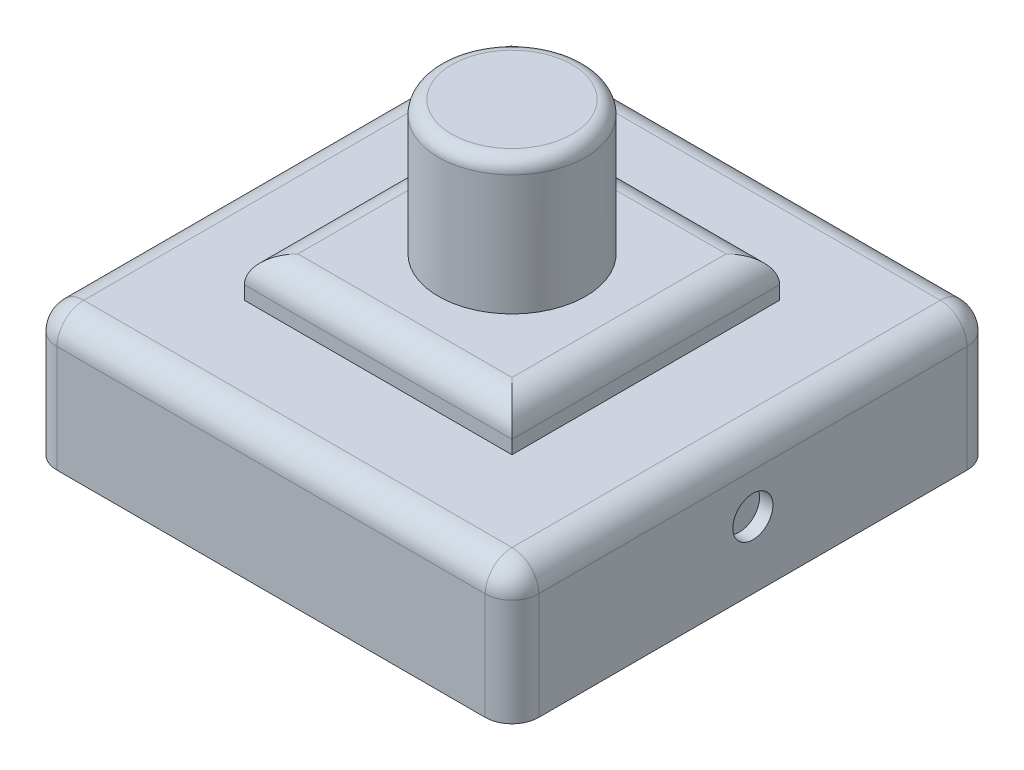
ISO-10303-21;
HEADER;
FILE_DESCRIPTION(('STEP AP214'),'2;1');
FILE_NAME('part.step','',(''),(''),'','','');
FILE_SCHEMA(('AUTOMOTIVE_DESIGN { 1 0 10303 214 1 1 1 1 }'));
ENDSEC;
DATA;
#1=APPLICATION_CONTEXT('core data for automotive mechanical design processes');
#2=APPLICATION_PROTOCOL_DEFINITION('international standard','automotive_design',2000,#1);
#3=PRODUCT_CONTEXT('',#1,'mechanical');
#4=PRODUCT('Part','Part','',(#3));
#5=PRODUCT_RELATED_PRODUCT_CATEGORY('part','',(#4));
#6=PRODUCT_DEFINITION_FORMATION('','',#4);
#7=PRODUCT_DEFINITION_CONTEXT('part definition',#1,'design');
#8=PRODUCT_DEFINITION('design','',#6,#7);
#9=PRODUCT_DEFINITION_SHAPE('','',#8);
#10=(LENGTH_UNIT() NAMED_UNIT(*) SI_UNIT(.MILLI.,.METRE.));
#11=(NAMED_UNIT(*) PLANE_ANGLE_UNIT() SI_UNIT($,.RADIAN.));
#12=(NAMED_UNIT(*) SI_UNIT($,.STERADIAN.) SOLID_ANGLE_UNIT());
#13=UNCERTAINTY_MEASURE_WITH_UNIT(LENGTH_MEASURE(1.E-05),#10,'distance_accuracy_value','');
#14=(GEOMETRIC_REPRESENTATION_CONTEXT(3) GLOBAL_UNCERTAINTY_ASSIGNED_CONTEXT((#13)) GLOBAL_UNIT_ASSIGNED_CONTEXT((#10,
#11,#12)) REPRESENTATION_CONTEXT('',''));
#15=CARTESIAN_POINT('',(0.,0.,0.));
#16=DIRECTION('',(0.,0.,1.));
#17=DIRECTION('',(1.,0.,0.));
#18=AXIS2_PLACEMENT_3D('',#15,#16,#17);
#19=CARTESIAN_POINT('',(0.,0.,0.));
#20=DIRECTION('',(0.,-1.,0.));
#21=DIRECTION('',(0.,0.,-1.));
#22=AXIS2_PLACEMENT_3D('',#19,#20,#21);
#23=PLANE('',#22);
#24=DIRECTION('',(0.,0.,1.));
#25=VECTOR('',#24,1.);
#26=CARTESIAN_POINT('',(-16.,0.,18.));
#27=LINE('',#26,#25);
#28=CARTESIAN_POINT('',(-16.,0.,-16.));
#29=VERTEX_POINT('',#28);
#30=CARTESIAN_POINT('',(-16.,0.,16.));
#31=VERTEX_POINT('',#30);
#32=EDGE_CURVE('E218',#29,#31,#27,.T.);
#33=ORIENTED_EDGE('',*,*,#32,.T.);
#34=DIRECTION('',(1.,0.,0.));
#35=VECTOR('',#34,1.);
#36=CARTESIAN_POINT('',(18.,0.,16.));
#37=LINE('',#36,#35);
#38=CARTESIAN_POINT('',(16.,0.,16.));
#39=VERTEX_POINT('',#38);
#40=EDGE_CURVE('E220',#31,#39,#37,.T.);
#41=ORIENTED_EDGE('',*,*,#40,.T.);
#42=DIRECTION('',(0.,0.,-1.));
#43=VECTOR('',#42,1.);
#44=CARTESIAN_POINT('',(16.,0.,-18.));
#45=LINE('',#44,#43);
#46=CARTESIAN_POINT('',(16.,0.,-16.));
#47=VERTEX_POINT('',#46);
#48=EDGE_CURVE('E214',#39,#47,#45,.T.);
#49=ORIENTED_EDGE('',*,*,#48,.T.);
#50=DIRECTION('',(-1.,0.,0.));
#51=VECTOR('',#50,1.);
#52=CARTESIAN_POINT('',(-18.,0.,-16.));
#53=LINE('',#52,#51);
#54=EDGE_CURVE('E216',#47,#29,#53,.T.);
#55=ORIENTED_EDGE('',*,*,#54,.T.);
#56=EDGE_LOOP('',(#33,#41,#49,#55));
#57=FACE_BOUND('',#56,.T.);
#58=DIRECTION('',(0.,0.,-1.));
#59=VECTOR('',#58,1.);
#60=CARTESIAN_POINT('',(10.,0.,10.));
#61=LINE('',#60,#59);
#62=CARTESIAN_POINT('',(10.,0.,10.));
#63=VERTEX_POINT('',#62);
#64=CARTESIAN_POINT('',(10.,0.,-10.));
#65=VERTEX_POINT('',#64);
#66=EDGE_CURVE('E153',#63,#65,#61,.T.);
#67=ORIENTED_EDGE('',*,*,#66,.F.);
#68=DIRECTION('',(1.,0.,0.));
#69=VECTOR('',#68,1.);
#70=CARTESIAN_POINT('',(-10.,0.,10.));
#71=LINE('',#70,#69);
#72=CARTESIAN_POINT('',(-10.,0.,10.));
#73=VERTEX_POINT('',#72);
#74=EDGE_CURVE('E160',#73,#63,#71,.T.);
#75=ORIENTED_EDGE('',*,*,#74,.F.);
#76=DIRECTION('',(0.,0.,1.));
#77=VECTOR('',#76,1.);
#78=CARTESIAN_POINT('',(-10.,0.,10.));
#79=LINE('',#78,#77);
#80=CARTESIAN_POINT('',(-10.,0.,-10.));
#81=VERTEX_POINT('',#80);
#82=EDGE_CURVE('E173',#81,#73,#79,.T.);
#83=ORIENTED_EDGE('',*,*,#82,.F.);
#84=DIRECTION('',(-1.,0.,0.));
#85=VECTOR('',#84,1.);
#86=CARTESIAN_POINT('',(-10.,0.,-10.));
#87=LINE('',#86,#85);
#88=EDGE_CURVE('E168',#65,#81,#87,.T.);
#89=ORIENTED_EDGE('',*,*,#88,.F.);
#90=EDGE_LOOP('',(#67,#75,#83,#89));
#91=FACE_BOUND('',#90,.T.);
#92=ADVANCED_FACE('F36',(#57,#91),#23,.F.);
#93=CARTESIAN_POINT('',(18.,-10.,18.));
#94=DIRECTION('',(1.,0.,0.));
#95=DIRECTION('',(0.,0.,-1.));
#96=AXIS2_PLACEMENT_3D('',#93,#94,#95);
#97=PLANE('',#96);
#98=CARTESIAN_POINT('',(18.,-5.,0.));
#99=DIRECTION('',(1.,0.,0.));
#100=DIRECTION('',(0.,0.,-1.));
#101=AXIS2_PLACEMENT_3D('',#98,#99,#100);
#102=CIRCLE('',#101,1.5);
#103=CARTESIAN_POINT('',(18.,-5.,-1.5));
#104=VERTEX_POINT('',#103);
#105=EDGE_CURVE('E265',#104,#104,#102,.T.);
#106=ORIENTED_EDGE('',*,*,#105,.F.);
#107=EDGE_LOOP('',(#106));
#108=FACE_BOUND('',#107,.T.);
#109=DIRECTION('',(0.,0.,-1.));
#110=VECTOR('',#109,1.);
#111=CARTESIAN_POINT('',(18.,-10.,18.));
#112=LINE('',#111,#110);
#113=CARTESIAN_POINT('',(18.,-10.,16.));
#114=VERTEX_POINT('',#113);
#115=CARTESIAN_POINT('',(18.,-10.,-16.));
#116=VERTEX_POINT('',#115);
#117=EDGE_CURVE('E183',#114,#116,#112,.T.);
#118=ORIENTED_EDGE('',*,*,#117,.T.);
#119=DIRECTION('',(0.,1.,0.));
#120=VECTOR('',#119,1.);
#121=CARTESIAN_POINT('',(18.,-10.,-16.));
#122=LINE('',#121,#120);
#123=CARTESIAN_POINT('',(18.,-2.,-16.));
#124=VERTEX_POINT('',#123);
#125=EDGE_CURVE('E51',#116,#124,#122,.T.);
#126=ORIENTED_EDGE('',*,*,#125,.T.);
#127=DIRECTION('',(0.,0.,-1.));
#128=VECTOR('',#127,1.);
#129=CARTESIAN_POINT('',(18.,-2.,18.));
#130=LINE('',#129,#128);
#131=CARTESIAN_POINT('',(18.,-2.,16.));
#132=VERTEX_POINT('',#131);
#133=EDGE_CURVE('E56',#124,#132,#130,.F.);
#134=ORIENTED_EDGE('',*,*,#133,.T.);
#135=DIRECTION('',(0.,1.,0.));
#136=VECTOR('',#135,1.);
#137=CARTESIAN_POINT('',(18.,-10.,16.));
#138=LINE('',#137,#136);
#139=EDGE_CURVE('E242',#132,#114,#138,.F.);
#140=ORIENTED_EDGE('',*,*,#139,.T.);
#141=EDGE_LOOP('',(#118,#126,#134,#140));
#142=FACE_BOUND('',#141,.T.);
#143=ADVANCED_FACE('F314',(#108,#142),#97,.T.);
#144=CARTESIAN_POINT('',(-18.,-10.,18.));
#145=DIRECTION('',(0.,0.,1.));
#146=DIRECTION('',(1.,0.,0.));
#147=AXIS2_PLACEMENT_3D('',#144,#145,#146);
#148=PLANE('',#147);
#149=DIRECTION('',(1.,0.,0.));
#150=VECTOR('',#149,1.);
#151=CARTESIAN_POINT('',(-18.,-10.,18.));
#152=LINE('',#151,#150);
#153=CARTESIAN_POINT('',(-16.,-10.,18.));
#154=VERTEX_POINT('',#153);
#155=CARTESIAN_POINT('',(16.,-10.,18.));
#156=VERTEX_POINT('',#155);
#157=EDGE_CURVE('E191',#154,#156,#152,.T.);
#158=ORIENTED_EDGE('',*,*,#157,.T.);
#159=DIRECTION('',(0.,1.,0.));
#160=VECTOR('',#159,1.);
#161=CARTESIAN_POINT('',(16.,-10.,18.));
#162=LINE('',#161,#160);
#163=CARTESIAN_POINT('',(16.,-2.,18.));
#164=VERTEX_POINT('',#163);
#165=EDGE_CURVE('E228',#156,#164,#162,.T.);
#166=ORIENTED_EDGE('',*,*,#165,.T.);
#167=DIRECTION('',(1.,0.,0.));
#168=VECTOR('',#167,1.);
#169=CARTESIAN_POINT('',(-18.,-2.,18.));
#170=LINE('',#169,#168);
#171=CARTESIAN_POINT('',(-16.,-2.,18.));
#172=VERTEX_POINT('',#171);
#173=EDGE_CURVE('E225',#164,#172,#170,.F.);
#174=ORIENTED_EDGE('',*,*,#173,.T.);
#175=DIRECTION('',(0.,1.,0.));
#176=VECTOR('',#175,1.);
#177=CARTESIAN_POINT('',(-16.,-10.,18.));
#178=LINE('',#177,#176);
#179=EDGE_CURVE('E223',#172,#154,#178,.F.);
#180=ORIENTED_EDGE('',*,*,#179,.T.);
#181=EDGE_LOOP('',(#158,#166,#174,#180));
#182=FACE_BOUND('',#181,.T.);
#183=ADVANCED_FACE('F321',(#182),#148,.T.);
#184=CARTESIAN_POINT('',(-18.,-10.,18.));
#185=DIRECTION('',(-1.,0.,0.));
#186=DIRECTION('',(0.,0.,1.));
#187=AXIS2_PLACEMENT_3D('',#184,#185,#186);
#188=PLANE('',#187);
#189=CARTESIAN_POINT('',(-18.,-5.,0.));
#190=DIRECTION('',(-1.,0.,0.));
#191=DIRECTION('',(0.,0.,1.));
#192=AXIS2_PLACEMENT_3D('',#189,#190,#191);
#193=CIRCLE('',#192,1.5);
#194=CARTESIAN_POINT('',(-18.,-5.,1.5));
#195=VERTEX_POINT('',#194);
#196=EDGE_CURVE('E478',#195,#195,#193,.T.);
#197=ORIENTED_EDGE('',*,*,#196,.F.);
#198=EDGE_LOOP('',(#197));
#199=FACE_BOUND('',#198,.T.);
#200=DIRECTION('',(0.,0.,1.));
#201=VECTOR('',#200,1.);
#202=CARTESIAN_POINT('',(-18.,-10.,18.));
#203=LINE('',#202,#201);
#204=CARTESIAN_POINT('',(-18.,-10.,-16.));
#205=VERTEX_POINT('',#204);
#206=CARTESIAN_POINT('',(-18.,-10.,16.));
#207=VERTEX_POINT('',#206);
#208=EDGE_CURVE('E188',#205,#207,#203,.T.);
#209=ORIENTED_EDGE('',*,*,#208,.T.);
#210=DIRECTION('',(0.,1.,0.));
#211=VECTOR('',#210,1.);
#212=CARTESIAN_POINT('',(-18.,-10.,16.));
#213=LINE('',#212,#211);
#214=CARTESIAN_POINT('',(-18.,-2.,16.));
#215=VERTEX_POINT('',#214);
#216=EDGE_CURVE('E234',#207,#215,#213,.T.);
#217=ORIENTED_EDGE('',*,*,#216,.T.);
#218=DIRECTION('',(0.,0.,1.));
#219=VECTOR('',#218,1.);
#220=CARTESIAN_POINT('',(-18.,-2.,-18.));
#221=LINE('',#220,#219);
#222=CARTESIAN_POINT('',(-18.,-2.,-16.));
#223=VERTEX_POINT('',#222);
#224=EDGE_CURVE('E232',#215,#223,#221,.F.);
#225=ORIENTED_EDGE('',*,*,#224,.T.);
#226=DIRECTION('',(0.,1.,0.));
#227=VECTOR('',#226,1.);
#228=CARTESIAN_POINT('',(-18.,-10.,-16.));
#229=LINE('',#228,#227);
#230=EDGE_CURVE('E230',#223,#205,#229,.F.);
#231=ORIENTED_EDGE('',*,*,#230,.T.);
#232=EDGE_LOOP('',(#209,#217,#225,#231));
#233=FACE_BOUND('',#232,.T.);
#234=ADVANCED_FACE('F330',(#199,#233),#188,.T.);
#235=CARTESIAN_POINT('',(-18.,-10.,-18.));
#236=DIRECTION('',(0.,0.,-1.));
#237=DIRECTION('',(-1.,0.,0.));
#238=AXIS2_PLACEMENT_3D('',#235,#236,#237);
#239=PLANE('',#238);
#240=DIRECTION('',(-1.,0.,0.));
#241=VECTOR('',#240,1.);
#242=CARTESIAN_POINT('',(18.,-2.,-18.));
#243=LINE('',#242,#241);
#244=CARTESIAN_POINT('',(-16.,-2.,-18.));
#245=VERTEX_POINT('',#244);
#246=CARTESIAN_POINT('',(16.,-2.,-18.));
#247=VERTEX_POINT('',#246);
#248=EDGE_CURVE('E238',#245,#247,#243,.F.);
#249=ORIENTED_EDGE('',*,*,#248,.T.);
#250=DIRECTION('',(0.,1.,0.));
#251=VECTOR('',#250,1.);
#252=CARTESIAN_POINT('',(16.,-10.,-18.));
#253=LINE('',#252,#251);
#254=CARTESIAN_POINT('',(16.,-10.,-18.));
#255=VERTEX_POINT('',#254);
#256=EDGE_CURVE('E240',#247,#255,#253,.F.);
#257=ORIENTED_EDGE('',*,*,#256,.T.);
#258=DIRECTION('',(-1.,0.,0.));
#259=VECTOR('',#258,1.);
#260=CARTESIAN_POINT('',(-18.,-10.,-18.));
#261=LINE('',#260,#259);
#262=CARTESIAN_POINT('',(-16.,-10.,-18.));
#263=VERTEX_POINT('',#262);
#264=EDGE_CURVE('E185',#255,#263,#261,.T.);
#265=ORIENTED_EDGE('',*,*,#264,.T.);
#266=DIRECTION('',(0.,1.,0.));
#267=VECTOR('',#266,1.);
#268=CARTESIAN_POINT('',(-16.,-10.,-18.));
#269=LINE('',#268,#267);
#270=EDGE_CURVE('E236',#263,#245,#269,.T.);
#271=ORIENTED_EDGE('',*,*,#270,.T.);
#272=EDGE_LOOP('',(#249,#257,#265,#271));
#273=FACE_BOUND('',#272,.T.);
#274=ADVANCED_FACE('F334',(#273),#239,.T.);
#275=CARTESIAN_POINT('',(0.,-10.,0.));
#276=DIRECTION('',(0.,-1.,0.));
#277=DIRECTION('',(0.,0.,-1.));
#278=AXIS2_PLACEMENT_3D('',#275,#276,#277);
#279=PLANE('',#278);
#280=ORIENTED_EDGE('',*,*,#264,.F.);
#281=CARTESIAN_POINT('',(16.,-10.,-16.));
#282=DIRECTION('',(0.,-1.,0.));
#283=DIRECTION('',(0.,0.,-1.));
#284=AXIS2_PLACEMENT_3D('',#281,#282,#283);
#285=CIRCLE('',#284,2.);
#286=EDGE_CURVE('E252',#255,#116,#285,.T.);
#287=ORIENTED_EDGE('',*,*,#286,.T.);
#288=ORIENTED_EDGE('',*,*,#117,.F.);
#289=CARTESIAN_POINT('',(16.,-10.,16.));
#290=DIRECTION('',(0.,-1.,0.));
#291=DIRECTION('',(0.,0.,-1.));
#292=AXIS2_PLACEMENT_3D('',#289,#290,#291);
#293=CIRCLE('',#292,2.);
#294=EDGE_CURVE('E250',#114,#156,#293,.T.);
#295=ORIENTED_EDGE('',*,*,#294,.T.);
#296=ORIENTED_EDGE('',*,*,#157,.F.);
#297=CARTESIAN_POINT('',(-16.,-10.,16.));
#298=DIRECTION('',(0.,-1.,0.));
#299=DIRECTION('',(0.,0.,-1.));
#300=AXIS2_PLACEMENT_3D('',#297,#298,#299);
#301=CIRCLE('',#300,2.);
#302=EDGE_CURVE('E248',#154,#207,#301,.T.);
#303=ORIENTED_EDGE('',*,*,#302,.T.);
#304=ORIENTED_EDGE('',*,*,#208,.F.);
#305=CARTESIAN_POINT('',(-16.,-10.,-16.));
#306=DIRECTION('',(0.,-1.,0.));
#307=DIRECTION('',(0.,0.,-1.));
#308=AXIS2_PLACEMENT_3D('',#305,#306,#307);
#309=CIRCLE('',#308,2.);
#310=EDGE_CURVE('E246',#205,#263,#309,.T.);
#311=ORIENTED_EDGE('',*,*,#310,.T.);
#312=EDGE_LOOP('',(#280,#287,#288,#295,#296,#303,#304,#311));
#313=FACE_BOUND('',#312,.T.);
#314=ADVANCED_FACE('F326',(#313),#279,.T.);
#315=CARTESIAN_POINT('',(10.,3.,10.));
#316=DIRECTION('',(-1.,0.,0.));
#317=DIRECTION('',(0.,0.,1.));
#318=AXIS2_PLACEMENT_3D('',#315,#316,#317);
#319=PLANE('',#318);
#320=DIRECTION('',(0.,-1.,0.));
#321=VECTOR('',#320,1.);
#322=CARTESIAN_POINT('',(10.,3.,-10.));
#323=LINE('',#322,#321);
#324=CARTESIAN_POINT('',(10.,1.,-10.));
#325=VERTEX_POINT('',#324);
#326=EDGE_CURVE('E181',#325,#65,#323,.T.);
#327=ORIENTED_EDGE('',*,*,#326,.F.);
#328=DIRECTION('',(0.,0.,-1.));
#329=VECTOR('',#328,1.);
#330=CARTESIAN_POINT('',(10.,1.,10.));
#331=LINE('',#330,#329);
#332=CARTESIAN_POINT('',(10.,1.,10.));
#333=VERTEX_POINT('',#332);
#334=EDGE_CURVE('E155',#325,#333,#331,.F.);
#335=ORIENTED_EDGE('',*,*,#334,.T.);
#336=DIRECTION('',(0.,-1.,0.));
#337=VECTOR('',#336,1.);
#338=CARTESIAN_POINT('',(10.,3.,10.));
#339=LINE('',#338,#337);
#340=EDGE_CURVE('E149',#333,#63,#339,.T.);
#341=ORIENTED_EDGE('',*,*,#340,.T.);
#342=ORIENTED_EDGE('',*,*,#66,.T.);
#343=EDGE_LOOP('',(#327,#335,#341,#342));
#344=FACE_BOUND('',#343,.T.);
#345=ADVANCED_FACE('F152',(#344),#319,.F.);
#346=CARTESIAN_POINT('',(-10.,3.,-10.));
#347=DIRECTION('',(0.,0.,1.));
#348=DIRECTION('',(1.,0.,0.));
#349=AXIS2_PLACEMENT_3D('',#346,#347,#348);
#350=PLANE('',#349);
#351=DIRECTION('',(0.,-1.,0.));
#352=VECTOR('',#351,1.);
#353=CARTESIAN_POINT('',(-10.,3.,-10.));
#354=LINE('',#353,#352);
#355=CARTESIAN_POINT('',(-10.,1.,-10.));
#356=VERTEX_POINT('',#355);
#357=EDGE_CURVE('E179',#356,#81,#354,.T.);
#358=ORIENTED_EDGE('',*,*,#357,.F.);
#359=DIRECTION('',(-1.,0.,0.));
#360=VECTOR('',#359,1.);
#361=CARTESIAN_POINT('',(-10.,1.,-10.));
#362=LINE('',#361,#360);
#363=EDGE_CURVE('E209',#356,#325,#362,.F.);
#364=ORIENTED_EDGE('',*,*,#363,.T.);
#365=ORIENTED_EDGE('',*,*,#326,.T.);
#366=ORIENTED_EDGE('',*,*,#88,.T.);
#367=EDGE_LOOP('',(#358,#364,#365,#366));
#368=FACE_BOUND('',#367,.T.);
#369=ADVANCED_FACE('F437',(#368),#350,.F.);
#370=CARTESIAN_POINT('',(-10.,3.,10.));
#371=DIRECTION('',(1.,0.,0.));
#372=DIRECTION('',(0.,0.,-1.));
#373=AXIS2_PLACEMENT_3D('',#370,#371,#372);
#374=PLANE('',#373);
#375=DIRECTION('',(0.,-1.,0.));
#376=VECTOR('',#375,1.);
#377=CARTESIAN_POINT('',(-10.,3.,10.));
#378=LINE('',#377,#376);
#379=CARTESIAN_POINT('',(-10.,1.,10.));
#380=VERTEX_POINT('',#379);
#381=EDGE_CURVE('E159',#380,#73,#378,.T.);
#382=ORIENTED_EDGE('',*,*,#381,.F.);
#383=DIRECTION('',(0.,0.,1.));
#384=VECTOR('',#383,1.);
#385=CARTESIAN_POINT('',(-10.,1.,10.));
#386=LINE('',#385,#384);
#387=EDGE_CURVE('E206',#380,#356,#386,.F.);
#388=ORIENTED_EDGE('',*,*,#387,.T.);
#389=ORIENTED_EDGE('',*,*,#357,.T.);
#390=ORIENTED_EDGE('',*,*,#82,.T.);
#391=EDGE_LOOP('',(#382,#388,#389,#390));
#392=FACE_BOUND('',#391,.T.);
#393=ADVANCED_FACE('F441',(#392),#374,.F.);
#394=CARTESIAN_POINT('',(-10.,3.,10.));
#395=DIRECTION('',(0.,0.,-1.));
#396=DIRECTION('',(-1.,0.,0.));
#397=AXIS2_PLACEMENT_3D('',#394,#395,#396);
#398=PLANE('',#397);
#399=ORIENTED_EDGE('',*,*,#340,.F.);
#400=DIRECTION('',(1.,0.,0.));
#401=VECTOR('',#400,1.);
#402=CARTESIAN_POINT('',(-10.,1.,10.));
#403=LINE('',#402,#401);
#404=EDGE_CURVE('E212',#333,#380,#403,.F.);
#405=ORIENTED_EDGE('',*,*,#404,.T.);
#406=ORIENTED_EDGE('',*,*,#381,.T.);
#407=ORIENTED_EDGE('',*,*,#74,.T.);
#408=EDGE_LOOP('',(#399,#405,#406,#407));
#409=FACE_BOUND('',#408,.T.);
#410=ADVANCED_FACE('F171',(#409),#398,.F.);
#411=CARTESIAN_POINT('',(0.,3.,0.));
#412=DIRECTION('',(0.,-1.,0.));
#413=DIRECTION('',(0.,0.,-1.));
#414=AXIS2_PLACEMENT_3D('',#411,#412,#413);
#415=PLANE('',#414);
#416=DIRECTION('',(-1.,0.,0.));
#417=VECTOR('',#416,1.);
#418=CARTESIAN_POINT('',(0.,3.,-8.));
#419=LINE('',#418,#417);
#420=CARTESIAN_POINT('',(8.,3.,-8.));
#421=VERTEX_POINT('',#420);
#422=CARTESIAN_POINT('',(-8.,3.,-8.));
#423=VERTEX_POINT('',#422);
#424=EDGE_CURVE('E201',#421,#423,#419,.T.);
#425=ORIENTED_EDGE('',*,*,#424,.T.);
#426=DIRECTION('',(0.,0.,1.));
#427=VECTOR('',#426,1.);
#428=CARTESIAN_POINT('',(-8.,3.,0.));
#429=LINE('',#428,#427);
#430=CARTESIAN_POINT('',(-8.,3.,8.));
#431=VERTEX_POINT('',#430);
#432=EDGE_CURVE('E203',#423,#431,#429,.T.);
#433=ORIENTED_EDGE('',*,*,#432,.T.);
#434=DIRECTION('',(1.,0.,0.));
#435=VECTOR('',#434,1.);
#436=CARTESIAN_POINT('',(0.,3.,8.));
#437=LINE('',#436,#435);
#438=CARTESIAN_POINT('',(8.,3.,8.));
#439=VERTEX_POINT('',#438);
#440=EDGE_CURVE('E197',#431,#439,#437,.T.);
#441=ORIENTED_EDGE('',*,*,#440,.T.);
#442=DIRECTION('',(0.,0.,-1.));
#443=VECTOR('',#442,1.);
#444=CARTESIAN_POINT('',(8.,3.,0.));
#445=LINE('',#444,#443);
#446=EDGE_CURVE('E199',#439,#421,#445,.T.);
#447=ORIENTED_EDGE('',*,*,#446,.T.);
#448=EDGE_LOOP('',(#425,#433,#441,#447));
#449=FACE_BOUND('',#448,.T.);
#450=CARTESIAN_POINT('',(0.,3.,0.));
#451=DIRECTION('',(0.,-1.,0.));
#452=DIRECTION('',(0.,0.,-1.));
#453=AXIS2_PLACEMENT_3D('',#450,#451,#452);
#454=CIRCLE('',#453,5.5);
#455=CARTESIAN_POINT('',(0.,3.,-5.5));
#456=VERTEX_POINT('',#455);
#457=EDGE_CURVE('E194',#456,#456,#454,.F.);
#458=ORIENTED_EDGE('',*,*,#457,.F.);
#459=EDGE_LOOP('',(#458));
#460=FACE_BOUND('',#459,.T.);
#461=ADVANCED_FACE('F450',(#449,#460),#415,.F.);
#462=CARTESIAN_POINT('',(0.,13.,0.));
#463=DIRECTION('',(0.,-1.,0.));
#464=DIRECTION('',(0.,0.,-1.));
#465=AXIS2_PLACEMENT_3D('',#462,#463,#464);
#466=CYLINDRICAL_SURFACE('',#465,5.5);
#467=CARTESIAN_POINT('',(0.,12.,0.));
#468=DIRECTION('',(0.,1.,0.));
#469=DIRECTION('',(0.,0.,1.));
#470=AXIS2_PLACEMENT_3D('',#467,#468,#469);
#471=CIRCLE('',#470,5.5);
#472=CARTESIAN_POINT('',(0.,12.,5.5));
#473=VERTEX_POINT('',#472);
#474=EDGE_CURVE('E11',#473,#473,#471,.F.);
#475=ORIENTED_EDGE('',*,*,#474,.T.);
#476=EDGE_LOOP('',(#475));
#477=FACE_BOUND('',#476,.T.);
#478=ORIENTED_EDGE('',*,*,#457,.T.);
#479=EDGE_LOOP('',(#478));
#480=FACE_BOUND('',#479,.T.);
#481=ADVANCED_FACE('F453',(#477,#480),#466,.T.);
#482=CARTESIAN_POINT('',(0.,13.,0.));
#483=DIRECTION('',(0.,1.,0.));
#484=DIRECTION('',(0.,0.,1.));
#485=AXIS2_PLACEMENT_3D('',#482,#483,#484);
#486=PLANE('',#485);
#487=CARTESIAN_POINT('',(0.,13.,0.));
#488=DIRECTION('',(0.,1.,0.));
#489=DIRECTION('',(0.,0.,1.));
#490=AXIS2_PLACEMENT_3D('',#487,#488,#489);
#491=CIRCLE('',#490,4.5);
#492=CARTESIAN_POINT('',(0.,13.,4.5));
#493=VERTEX_POINT('',#492);
#494=EDGE_CURVE('E44',#493,#493,#491,.T.);
#495=ORIENTED_EDGE('',*,*,#494,.T.);
#496=EDGE_LOOP('',(#495));
#497=FACE_BOUND('',#496,.T.);
#498=ADVANCED_FACE('F301',(#497),#486,.T.);
#499=CARTESIAN_POINT('',(-17.,-5.,0.));
#500=DIRECTION('',(-1.,0.,0.));
#501=DIRECTION('',(0.,0.,1.));
#502=AXIS2_PLACEMENT_3D('',#499,#500,#501);
#503=CYLINDRICAL_SURFACE('',#502,1.5);
#504=CARTESIAN_POINT('',(-17.,-5.,0.));
#505=DIRECTION('',(-1.,0.,0.));
#506=DIRECTION('',(0.,0.,1.));
#507=AXIS2_PLACEMENT_3D('',#504,#505,#506);
#508=CIRCLE('',#507,1.5);
#509=CARTESIAN_POINT('',(-17.,-5.,1.5));
#510=VERTEX_POINT('',#509);
#511=EDGE_CURVE('E169',#510,#510,#508,.T.);
#512=ORIENTED_EDGE('',*,*,#511,.F.);
#513=EDGE_LOOP('',(#512));
#514=FACE_BOUND('',#513,.T.);
#515=ORIENTED_EDGE('',*,*,#196,.T.);
#516=EDGE_LOOP('',(#515));
#517=FACE_BOUND('',#516,.T.);
#518=ADVANCED_FACE('F460',(#514,#517),#503,.F.);
#519=CARTESIAN_POINT('',(-17.,0.,0.));
#520=DIRECTION('',(-1.,0.,0.));
#521=DIRECTION('',(0.,0.,1.));
#522=AXIS2_PLACEMENT_3D('',#519,#520,#521);
#523=PLANE('',#522);
#524=ORIENTED_EDGE('',*,*,#511,.T.);
#525=EDGE_LOOP('',(#524));
#526=FACE_BOUND('',#525,.T.);
#527=ADVANCED_FACE('F463',(#526),#523,.T.);
#528=CARTESIAN_POINT('',(17.,-5.,0.));
#529=DIRECTION('',(1.,0.,0.));
#530=DIRECTION('',(0.,0.,-1.));
#531=AXIS2_PLACEMENT_3D('',#528,#529,#530);
#532=CYLINDRICAL_SURFACE('',#531,1.5);
#533=CARTESIAN_POINT('',(17.,-5.,0.));
#534=DIRECTION('',(1.,0.,0.));
#535=DIRECTION('',(0.,0.,-1.));
#536=AXIS2_PLACEMENT_3D('',#533,#534,#535);
#537=CIRCLE('',#536,1.5);
#538=CARTESIAN_POINT('',(17.,-5.,-1.5));
#539=VERTEX_POINT('',#538);
#540=EDGE_CURVE('E477',#539,#539,#537,.T.);
#541=ORIENTED_EDGE('',*,*,#540,.F.);
#542=EDGE_LOOP('',(#541));
#543=FACE_BOUND('',#542,.T.);
#544=ORIENTED_EDGE('',*,*,#105,.T.);
#545=EDGE_LOOP('',(#544));
#546=FACE_BOUND('',#545,.T.);
#547=ADVANCED_FACE('F467',(#543,#546),#532,.F.);
#548=CARTESIAN_POINT('',(17.,0.,0.));
#549=DIRECTION('',(1.,0.,0.));
#550=DIRECTION('',(0.,0.,-1.));
#551=AXIS2_PLACEMENT_3D('',#548,#549,#550);
#552=PLANE('',#551);
#553=ORIENTED_EDGE('',*,*,#540,.T.);
#554=EDGE_LOOP('',(#553));
#555=FACE_BOUND('',#554,.T.);
#556=ADVANCED_FACE('F354',(#555),#552,.T.);
#557=CARTESIAN_POINT('',(8.,1.,0.));
#558=DIRECTION('',(0.,0.,-1.));
#559=DIRECTION('',(-1.,0.,0.));
#560=AXIS2_PLACEMENT_3D('',#557,#558,#559);
#561=CYLINDRICAL_SURFACE('',#560,2.);
#562=CARTESIAN_POINT('',(8.,1.,8.));
#563=DIRECTION('',(0.707106781186547,0.,-0.707106781186547));
#564=DIRECTION('',(0.707106781186547,0.,0.707106781186547));
#565=AXIS2_PLACEMENT_3D('',#562,#563,#564);
#566=ELLIPSE('',#565,2.82842712474619,2.);
#567=EDGE_CURVE('E259',#333,#439,#566,.F.);
#568=ORIENTED_EDGE('',*,*,#567,.F.);
#569=ORIENTED_EDGE('',*,*,#334,.F.);
#570=CARTESIAN_POINT('',(8.,1.,-8.));
#571=DIRECTION('',(-0.707106781186547,0.,-0.707106781186547));
#572=DIRECTION('',(0.707106781186547,0.,-0.707106781186547));
#573=AXIS2_PLACEMENT_3D('',#570,#571,#572);
#574=ELLIPSE('',#573,2.82842712474619,2.);
#575=EDGE_CURVE('E262',#421,#325,#574,.T.);
#576=ORIENTED_EDGE('',*,*,#575,.F.);
#577=ORIENTED_EDGE('',*,*,#446,.F.);
#578=EDGE_LOOP('',(#568,#569,#576,#577));
#579=FACE_BOUND('',#578,.T.);
#580=ADVANCED_FACE('F351',(#579),#561,.T.);
#581=CARTESIAN_POINT('',(0.,1.,-8.));
#582=DIRECTION('',(-1.,0.,0.));
#583=DIRECTION('',(0.,0.,1.));
#584=AXIS2_PLACEMENT_3D('',#581,#582,#583);
#585=CYLINDRICAL_SURFACE('',#584,2.);
#586=ORIENTED_EDGE('',*,*,#575,.T.);
#587=ORIENTED_EDGE('',*,*,#363,.F.);
#588=CARTESIAN_POINT('',(-8.,1.,-8.));
#589=DIRECTION('',(-0.707106781186547,0.,0.707106781186547));
#590=DIRECTION('',(-0.707106781186547,0.,-0.707106781186547));
#591=AXIS2_PLACEMENT_3D('',#588,#589,#590);
#592=ELLIPSE('',#591,2.82842712474619,2.);
#593=EDGE_CURVE('E256',#423,#356,#592,.T.);
#594=ORIENTED_EDGE('',*,*,#593,.F.);
#595=ORIENTED_EDGE('',*,*,#424,.F.);
#596=EDGE_LOOP('',(#586,#587,#594,#595));
#597=FACE_BOUND('',#596,.T.);
#598=ADVANCED_FACE('F347',(#597),#585,.T.);
#599=CARTESIAN_POINT('',(0.,1.,8.));
#600=DIRECTION('',(1.,0.,0.));
#601=DIRECTION('',(0.,0.,-1.));
#602=AXIS2_PLACEMENT_3D('',#599,#600,#601);
#603=CYLINDRICAL_SURFACE('',#602,2.);
#604=ORIENTED_EDGE('',*,*,#567,.T.);
#605=ORIENTED_EDGE('',*,*,#440,.F.);
#606=CARTESIAN_POINT('',(-8.,1.,8.));
#607=DIRECTION('',(0.707106781186547,0.,0.707106781186547));
#608=DIRECTION('',(0.707106781186547,0.,-0.707106781186547));
#609=AXIS2_PLACEMENT_3D('',#606,#607,#608);
#610=ELLIPSE('',#609,2.82842712474619,2.);
#611=EDGE_CURVE('E254',#380,#431,#610,.F.);
#612=ORIENTED_EDGE('',*,*,#611,.F.);
#613=ORIENTED_EDGE('',*,*,#404,.F.);
#614=EDGE_LOOP('',(#604,#605,#612,#613));
#615=FACE_BOUND('',#614,.T.);
#616=ADVANCED_FACE('F343',(#615),#603,.T.);
#617=CARTESIAN_POINT('',(-8.,1.,0.));
#618=DIRECTION('',(0.,0.,1.));
#619=DIRECTION('',(1.,0.,0.));
#620=AXIS2_PLACEMENT_3D('',#617,#618,#619);
#621=CYLINDRICAL_SURFACE('',#620,2.);
#622=ORIENTED_EDGE('',*,*,#593,.T.);
#623=ORIENTED_EDGE('',*,*,#387,.F.);
#624=ORIENTED_EDGE('',*,*,#611,.T.);
#625=ORIENTED_EDGE('',*,*,#432,.F.);
#626=EDGE_LOOP('',(#622,#623,#624,#625));
#627=FACE_BOUND('',#626,.T.);
#628=ADVANCED_FACE('F339',(#627),#621,.T.);
#629=CARTESIAN_POINT('',(-16.,-10.,-16.));
#630=DIRECTION('',(0.,1.,0.));
#631=DIRECTION('',(0.,0.,1.));
#632=AXIS2_PLACEMENT_3D('',#629,#630,#631);
#633=CYLINDRICAL_SURFACE('',#632,2.);
#634=ORIENTED_EDGE('',*,*,#310,.F.);
#635=ORIENTED_EDGE('',*,*,#230,.F.);
#636=CARTESIAN_POINT('',(-16.,-2.,-16.));
#637=DIRECTION('',(0.,1.,0.));
#638=DIRECTION('',(0.,0.,1.));
#639=AXIS2_PLACEMENT_3D('',#636,#637,#638);
#640=CIRCLE('',#639,2.);
#641=EDGE_CURVE('E257',#245,#223,#640,.T.);
#642=ORIENTED_EDGE('',*,*,#641,.F.);
#643=ORIENTED_EDGE('',*,*,#270,.F.);
#644=EDGE_LOOP('',(#634,#635,#642,#643));
#645=FACE_BOUND('',#644,.T.);
#646=ADVANCED_FACE('F342',(#645),#633,.T.);
#647=CARTESIAN_POINT('',(0.,-2.,-16.));
#648=DIRECTION('',(1.,0.,0.));
#649=DIRECTION('',(0.,0.,-1.));
#650=AXIS2_PLACEMENT_3D('',#647,#648,#649);
#651=CYLINDRICAL_SURFACE('',#650,2.);
#652=CARTESIAN_POINT('',(16.,-2.,-16.));
#653=DIRECTION('',(1.,0.,0.));
#654=DIRECTION('',(0.,0.,-1.));
#655=AXIS2_PLACEMENT_3D('',#652,#653,#654);
#656=CIRCLE('',#655,2.);
#657=EDGE_CURVE('E291',#247,#47,#656,.T.);
#658=ORIENTED_EDGE('',*,*,#657,.F.);
#659=ORIENTED_EDGE('',*,*,#248,.F.);
#660=CARTESIAN_POINT('',(-16.,-2.,-16.));
#661=DIRECTION('',(-1.,0.,0.));
#662=DIRECTION('',(0.,0.,1.));
#663=AXIS2_PLACEMENT_3D('',#660,#661,#662);
#664=CIRCLE('',#663,2.);
#665=EDGE_CURVE('E294',#29,#245,#664,.T.);
#666=ORIENTED_EDGE('',*,*,#665,.F.);
#667=ORIENTED_EDGE('',*,*,#54,.F.);
#668=EDGE_LOOP('',(#658,#659,#666,#667));
#669=FACE_BOUND('',#668,.T.);
#670=ADVANCED_FACE('F391',(#669),#651,.T.);
#671=CARTESIAN_POINT('',(16.,-10.,-16.));
#672=DIRECTION('',(0.,1.,0.));
#673=DIRECTION('',(0.,0.,1.));
#674=AXIS2_PLACEMENT_3D('',#671,#672,#673);
#675=CYLINDRICAL_SURFACE('',#674,2.);
#676=ORIENTED_EDGE('',*,*,#286,.F.);
#677=ORIENTED_EDGE('',*,*,#256,.F.);
#678=CARTESIAN_POINT('',(16.,-2.,-16.));
#679=DIRECTION('',(0.,1.,0.));
#680=DIRECTION('',(0.,0.,1.));
#681=AXIS2_PLACEMENT_3D('',#678,#679,#680);
#682=CIRCLE('',#681,2.);
#683=EDGE_CURVE('E288',#124,#247,#682,.T.);
#684=ORIENTED_EDGE('',*,*,#683,.F.);
#685=ORIENTED_EDGE('',*,*,#125,.F.);
#686=EDGE_LOOP('',(#676,#677,#684,#685));
#687=FACE_BOUND('',#686,.T.);
#688=ADVANCED_FACE('F387',(#687),#675,.T.);
#689=CARTESIAN_POINT('',(-16.,-2.,-16.));
#690=DIRECTION('',(0.,0.,1.));
#691=DIRECTION('',(1.,0.,0.));
#692=AXIS2_PLACEMENT_3D('',#689,#690,#691);
#693=SPHERICAL_SURFACE('',#692,2.);
#694=ORIENTED_EDGE('',*,*,#665,.T.);
#695=ORIENTED_EDGE('',*,*,#641,.T.);
#696=CARTESIAN_POINT('',(-16.,-2.,-16.));
#697=DIRECTION('',(0.,0.,-1.));
#698=DIRECTION('',(-1.,0.,0.));
#699=AXIS2_PLACEMENT_3D('',#696,#697,#698);
#700=CIRCLE('',#699,2.);
#701=EDGE_CURVE('E285',#29,#223,#700,.F.);
#702=ORIENTED_EDGE('',*,*,#701,.F.);
#703=EDGE_LOOP('',(#694,#695,#702));
#704=FACE_BOUND('',#703,.T.);
#705=ADVANCED_FACE('F383',(#704),#693,.T.);
#706=CARTESIAN_POINT('',(16.,-2.,-16.));
#707=DIRECTION('',(0.,0.,1.));
#708=DIRECTION('',(1.,0.,0.));
#709=AXIS2_PLACEMENT_3D('',#706,#707,#708);
#710=SPHERICAL_SURFACE('',#709,2.);
#711=ORIENTED_EDGE('',*,*,#683,.T.);
#712=ORIENTED_EDGE('',*,*,#657,.T.);
#713=CARTESIAN_POINT('',(16.,-2.,-16.));
#714=DIRECTION('',(0.,0.,-1.));
#715=DIRECTION('',(-1.,0.,0.));
#716=AXIS2_PLACEMENT_3D('',#713,#714,#715);
#717=CIRCLE('',#716,2.);
#718=EDGE_CURVE('E282',#124,#47,#717,.F.);
#719=ORIENTED_EDGE('',*,*,#718,.F.);
#720=EDGE_LOOP('',(#711,#712,#719));
#721=FACE_BOUND('',#720,.T.);
#722=ADVANCED_FACE('F379',(#721),#710,.T.);
#723=CARTESIAN_POINT('',(-16.,-10.,16.));
#724=DIRECTION('',(0.,1.,0.));
#725=DIRECTION('',(0.,0.,1.));
#726=AXIS2_PLACEMENT_3D('',#723,#724,#725);
#727=CYLINDRICAL_SURFACE('',#726,2.);
#728=ORIENTED_EDGE('',*,*,#302,.F.);
#729=ORIENTED_EDGE('',*,*,#179,.F.);
#730=CARTESIAN_POINT('',(-16.,-2.,16.));
#731=DIRECTION('',(0.,1.,0.));
#732=DIRECTION('',(0.,0.,1.));
#733=AXIS2_PLACEMENT_3D('',#730,#731,#732);
#734=CIRCLE('',#733,2.);
#735=EDGE_CURVE('E279',#215,#172,#734,.T.);
#736=ORIENTED_EDGE('',*,*,#735,.F.);
#737=ORIENTED_EDGE('',*,*,#216,.F.);
#738=EDGE_LOOP('',(#728,#729,#736,#737));
#739=FACE_BOUND('',#738,.T.);
#740=ADVANCED_FACE('F375',(#739),#727,.T.);
#741=CARTESIAN_POINT('',(-16.,-2.,0.));
#742=DIRECTION('',(0.,0.,-1.));
#743=DIRECTION('',(-1.,0.,0.));
#744=AXIS2_PLACEMENT_3D('',#741,#742,#743);
#745=CYLINDRICAL_SURFACE('',#744,2.);
#746=ORIENTED_EDGE('',*,*,#701,.T.);
#747=ORIENTED_EDGE('',*,*,#224,.F.);
#748=CARTESIAN_POINT('',(-16.,-2.,16.));
#749=DIRECTION('',(0.,0.,1.));
#750=DIRECTION('',(1.,0.,0.));
#751=AXIS2_PLACEMENT_3D('',#748,#749,#750);
#752=CIRCLE('',#751,2.);
#753=EDGE_CURVE('E276',#31,#215,#752,.T.);
#754=ORIENTED_EDGE('',*,*,#753,.F.);
#755=ORIENTED_EDGE('',*,*,#32,.F.);
#756=EDGE_LOOP('',(#746,#747,#754,#755));
#757=FACE_BOUND('',#756,.T.);
#758=ADVANCED_FACE('F371',(#757),#745,.T.);
#759=CARTESIAN_POINT('',(16.,-2.,0.));
#760=DIRECTION('',(0.,0.,1.));
#761=DIRECTION('',(1.,0.,0.));
#762=AXIS2_PLACEMENT_3D('',#759,#760,#761);
#763=CYLINDRICAL_SURFACE('',#762,2.);
#764=ORIENTED_EDGE('',*,*,#718,.T.);
#765=ORIENTED_EDGE('',*,*,#48,.F.);
#766=CARTESIAN_POINT('',(16.,-2.,16.));
#767=DIRECTION('',(0.,0.,1.));
#768=DIRECTION('',(1.,0.,0.));
#769=AXIS2_PLACEMENT_3D('',#766,#767,#768);
#770=CIRCLE('',#769,2.);
#771=EDGE_CURVE('E273',#132,#39,#770,.T.);
#772=ORIENTED_EDGE('',*,*,#771,.F.);
#773=ORIENTED_EDGE('',*,*,#133,.F.);
#774=EDGE_LOOP('',(#764,#765,#772,#773));
#775=FACE_BOUND('',#774,.T.);
#776=ADVANCED_FACE('F367',(#775),#763,.T.);
#777=CARTESIAN_POINT('',(16.,-10.,16.));
#778=DIRECTION('',(0.,1.,0.));
#779=DIRECTION('',(0.,0.,1.));
#780=AXIS2_PLACEMENT_3D('',#777,#778,#779);
#781=CYLINDRICAL_SURFACE('',#780,2.);
#782=ORIENTED_EDGE('',*,*,#294,.F.);
#783=ORIENTED_EDGE('',*,*,#139,.F.);
#784=CARTESIAN_POINT('',(16.,-2.,16.));
#785=DIRECTION('',(0.,1.,0.));
#786=DIRECTION('',(0.,0.,1.));
#787=AXIS2_PLACEMENT_3D('',#784,#785,#786);
#788=CIRCLE('',#787,2.);
#789=EDGE_CURVE('E270',#164,#132,#788,.T.);
#790=ORIENTED_EDGE('',*,*,#789,.F.);
#791=ORIENTED_EDGE('',*,*,#165,.F.);
#792=EDGE_LOOP('',(#782,#783,#790,#791));
#793=FACE_BOUND('',#792,.T.);
#794=ADVANCED_FACE('F363',(#793),#781,.T.);
#795=CARTESIAN_POINT('',(-16.,-2.,16.));
#796=DIRECTION('',(0.,0.,1.));
#797=DIRECTION('',(1.,0.,0.));
#798=AXIS2_PLACEMENT_3D('',#795,#796,#797);
#799=SPHERICAL_SURFACE('',#798,2.);
#800=ORIENTED_EDGE('',*,*,#753,.T.);
#801=ORIENTED_EDGE('',*,*,#735,.T.);
#802=CARTESIAN_POINT('',(-16.,-2.,16.));
#803=DIRECTION('',(-1.,0.,0.));
#804=DIRECTION('',(0.,0.,1.));
#805=AXIS2_PLACEMENT_3D('',#802,#803,#804);
#806=CIRCLE('',#805,2.);
#807=EDGE_CURVE('E268',#31,#172,#806,.F.);
#808=ORIENTED_EDGE('',*,*,#807,.F.);
#809=EDGE_LOOP('',(#800,#801,#808));
#810=FACE_BOUND('',#809,.T.);
#811=ADVANCED_FACE('F359',(#810),#799,.T.);
#812=CARTESIAN_POINT('',(16.,-2.,16.));
#813=DIRECTION('',(0.,0.,1.));
#814=DIRECTION('',(1.,0.,0.));
#815=AXIS2_PLACEMENT_3D('',#812,#813,#814);
#816=SPHERICAL_SURFACE('',#815,2.);
#817=ORIENTED_EDGE('',*,*,#789,.T.);
#818=ORIENTED_EDGE('',*,*,#771,.T.);
#819=CARTESIAN_POINT('',(16.,-2.,16.));
#820=DIRECTION('',(1.,0.,0.));
#821=DIRECTION('',(0.,0.,-1.));
#822=AXIS2_PLACEMENT_3D('',#819,#820,#821);
#823=CIRCLE('',#822,2.);
#824=EDGE_CURVE('E266',#164,#39,#823,.F.);
#825=ORIENTED_EDGE('',*,*,#824,.F.);
#826=EDGE_LOOP('',(#817,#818,#825));
#827=FACE_BOUND('',#826,.T.);
#828=ADVANCED_FACE('F309',(#827),#816,.T.);
#829=CARTESIAN_POINT('',(0.,-2.,16.));
#830=DIRECTION('',(-1.,0.,0.));
#831=DIRECTION('',(0.,0.,1.));
#832=AXIS2_PLACEMENT_3D('',#829,#830,#831);
#833=CYLINDRICAL_SURFACE('',#832,2.);
#834=ORIENTED_EDGE('',*,*,#807,.T.);
#835=ORIENTED_EDGE('',*,*,#173,.F.);
#836=ORIENTED_EDGE('',*,*,#824,.T.);
#837=ORIENTED_EDGE('',*,*,#40,.F.);
#838=EDGE_LOOP('',(#834,#835,#836,#837));
#839=FACE_BOUND('',#838,.T.);
#840=ADVANCED_FACE('F304',(#839),#833,.T.);
#841=CARTESIAN_POINT('',(0.,12.,0.));
#842=DIRECTION('',(0.,1.,0.));
#843=DIRECTION('',(0.,0.,1.));
#844=AXIS2_PLACEMENT_3D('',#841,#842,#843);
#845=TOROIDAL_SURFACE('',#844,4.5,1.);
#846=ORIENTED_EDGE('',*,*,#474,.F.);
#847=EDGE_LOOP('',(#846));
#848=FACE_BOUND('',#847,.T.);
#849=ORIENTED_EDGE('',*,*,#494,.F.);
#850=EDGE_LOOP('',(#849));
#851=FACE_BOUND('',#850,.T.);
#852=ADVANCED_FACE('F38',(#848,#851),#845,.T.);
#853=CLOSED_SHELL('',(#92,#143,#183,#234,#274,#314,#345,#369,#393,#410,#461,#481,#498,#518,#527,
#547,#556,#580,#598,#616,#628,#646,#670,#688,#705,#722,#740,#758,#776,#794,#811,#828,#840,#852));
#854=MANIFOLD_SOLID_BREP('B2',#853);
#855=ADVANCED_BREP_SHAPE_REPRESENTATION('',(#18,#854),#14);
#856=SHAPE_DEFINITION_REPRESENTATION(#9,#855);
ENDSEC;
END-ISO-10303-21;
